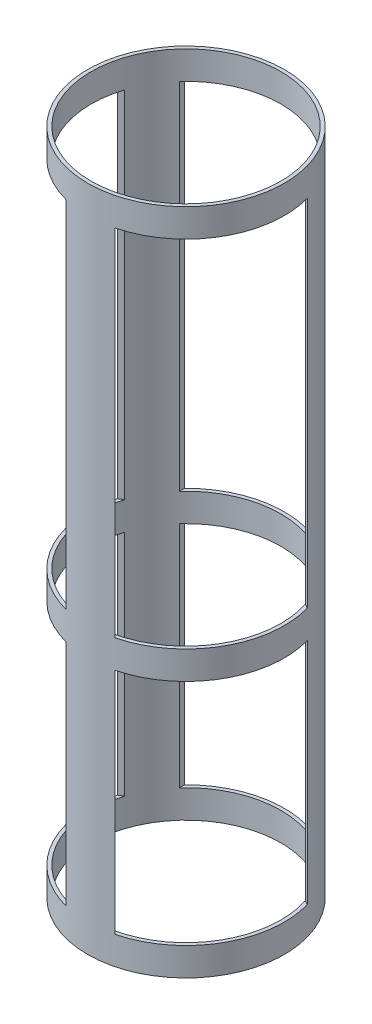
ISO-10303-21;
HEADER;
FILE_DESCRIPTION(('STEP AP214'),'2;1');
FILE_NAME('part.step','',(''),(''),'','','');
FILE_SCHEMA(('AUTOMOTIVE_DESIGN { 1 0 10303 214 1 1 1 1 }'));
ENDSEC;
DATA;
#1=APPLICATION_CONTEXT('core data for automotive mechanical design processes');
#2=APPLICATION_PROTOCOL_DEFINITION('international standard','automotive_design',2000,#1);
#3=PRODUCT_CONTEXT('',#1,'mechanical');
#4=PRODUCT('Part','Part','',(#3));
#5=PRODUCT_RELATED_PRODUCT_CATEGORY('part','',(#4));
#6=PRODUCT_DEFINITION_FORMATION('','',#4);
#7=PRODUCT_DEFINITION_CONTEXT('part definition',#1,'design');
#8=PRODUCT_DEFINITION('design','',#6,#7);
#9=PRODUCT_DEFINITION_SHAPE('','',#8);
#10=(LENGTH_UNIT() NAMED_UNIT(*) SI_UNIT(.MILLI.,.METRE.));
#11=(NAMED_UNIT(*) PLANE_ANGLE_UNIT() SI_UNIT($,.RADIAN.));
#12=(NAMED_UNIT(*) SI_UNIT($,.STERADIAN.) SOLID_ANGLE_UNIT());
#13=UNCERTAINTY_MEASURE_WITH_UNIT(LENGTH_MEASURE(1.E-05),#10,'distance_accuracy_value','');
#14=(GEOMETRIC_REPRESENTATION_CONTEXT(3) GLOBAL_UNCERTAINTY_ASSIGNED_CONTEXT((#13)) GLOBAL_UNIT_ASSIGNED_CONTEXT((#10,
#11,#12)) REPRESENTATION_CONTEXT('',''));
#15=CARTESIAN_POINT('',(0.,0.,0.));
#16=DIRECTION('',(0.,0.,1.));
#17=DIRECTION('',(1.,0.,0.));
#18=AXIS2_PLACEMENT_3D('',#15,#16,#17);
#19=CARTESIAN_POINT('',(0.,301.625,0.));
#20=DIRECTION('',(0.,1.,0.));
#21=DIRECTION('',(0.,0.,1.));
#22=AXIS2_PLACEMENT_3D('',#19,#20,#21);
#23=PLANE('',#22);
#24=CARTESIAN_POINT('',(0.,301.625,0.));
#25=DIRECTION('',(0.,1.,0.));
#26=DIRECTION('',(0.,0.,1.));
#27=AXIS2_PLACEMENT_3D('',#24,#25,#26);
#28=CIRCLE('',#27,88.9);
#29=CARTESIAN_POINT('',(0.,301.625,88.9));
#30=VERTEX_POINT('',#29);
#31=EDGE_CURVE('E380',#30,#30,#28,.T.);
#32=ORIENTED_EDGE('',*,*,#31,.T.);
#33=EDGE_LOOP('',(#32));
#34=FACE_BOUND('',#33,.T.);
#35=CARTESIAN_POINT('',(0.,301.625,0.));
#36=DIRECTION('',(0.,1.,0.));
#37=DIRECTION('',(0.,0.,1.));
#38=AXIS2_PLACEMENT_3D('',#35,#36,#37);
#39=CIRCLE('',#38,85.725);
#40=CARTESIAN_POINT('',(0.,301.625,85.725));
#41=VERTEX_POINT('',#40);
#42=EDGE_CURVE('E374',#41,#41,#39,.T.);
#43=ORIENTED_EDGE('',*,*,#42,.F.);
#44=EDGE_LOOP('',(#43));
#45=FACE_BOUND('',#44,.T.);
#46=ADVANCED_FACE('F41',(#34,#45),#23,.T.);
#47=CARTESIAN_POINT('',(0.,-301.625,0.));
#48=DIRECTION('',(0.,1.,0.));
#49=DIRECTION('',(0.,0.,1.));
#50=AXIS2_PLACEMENT_3D('',#47,#48,#49);
#51=PLANE('',#50);
#52=CARTESIAN_POINT('',(0.,-301.625,0.));
#53=DIRECTION('',(0.,1.,0.));
#54=DIRECTION('',(0.,0.,1.));
#55=AXIS2_PLACEMENT_3D('',#52,#53,#54);
#56=CIRCLE('',#55,88.9);
#57=CARTESIAN_POINT('',(0.,-301.625,88.9));
#58=VERTEX_POINT('',#57);
#59=EDGE_CURVE('E377',#58,#58,#56,.T.);
#60=ORIENTED_EDGE('',*,*,#59,.F.);
#61=EDGE_LOOP('',(#60));
#62=FACE_BOUND('',#61,.T.);
#63=CARTESIAN_POINT('',(0.,-301.625,0.));
#64=DIRECTION('',(0.,1.,0.));
#65=DIRECTION('',(0.,0.,1.));
#66=AXIS2_PLACEMENT_3D('',#63,#64,#65);
#67=CIRCLE('',#66,85.725);
#68=CARTESIAN_POINT('',(0.,-301.625,85.725));
#69=VERTEX_POINT('',#68);
#70=EDGE_CURVE('E332',#69,#69,#67,.T.);
#71=ORIENTED_EDGE('',*,*,#70,.T.);
#72=EDGE_LOOP('',(#71));
#73=FACE_BOUND('',#72,.T.);
#74=ADVANCED_FACE('F419',(#62,#73),#51,.F.);
#75=CARTESIAN_POINT('',(0.,301.625,0.));
#76=DIRECTION('',(0.,-1.,0.));
#77=DIRECTION('',(0.,0.,-1.));
#78=AXIS2_PLACEMENT_3D('',#75,#76,#77);
#79=CYLINDRICAL_SURFACE('',#78,88.9);
#80=CARTESIAN_POINT('',(0.,-44.3229999999999,0.));
#81=DIRECTION('',(0.,-1.,0.));
#82=DIRECTION('',(-0.500000000000004,0.,0.866025403784436));
#83=AXIS2_PLACEMENT_3D('',#80,#81,#82);
#84=CIRCLE('',#83,88.9);
#85=CARTESIAN_POINT('',(22.1315367264145,-44.3229999999999,86.1011328736583));
#86=VERTEX_POINT('',#85);
#87=CARTESIAN_POINT('',(85.631536726415,-44.323,-23.8840934069651));
#88=VERTEX_POINT('',#87);
#89=EDGE_CURVE('E234',#86,#88,#84,.F.);
#90=ORIENTED_EDGE('',*,*,#89,.F.);
#91=DIRECTION('',(0.,-1.,0.));
#92=VECTOR('',#91,1.);
#93=CARTESIAN_POINT('',(22.1315367264145,301.625,86.1011328736583));
#94=LINE('',#93,#92);
#95=CARTESIAN_POINT('',(22.1315367264145,276.225,86.1011328736583));
#96=VERTEX_POINT('',#95);
#97=EDGE_CURVE('E239',#96,#86,#94,.T.);
#98=ORIENTED_EDGE('',*,*,#97,.F.);
#99=CARTESIAN_POINT('',(0.,276.225,0.));
#100=DIRECTION('',(0.,1.,0.));
#101=DIRECTION('',(-0.866025403784436,0.,-0.500000000000004));
#102=AXIS2_PLACEMENT_3D('',#99,#100,#101);
#103=CIRCLE('',#102,88.9);
#104=CARTESIAN_POINT('',(85.631536726415,276.225,-23.8840934069651));
#105=VERTEX_POINT('',#104);
#106=EDGE_CURVE('E213',#105,#96,#103,.F.);
#107=ORIENTED_EDGE('',*,*,#106,.F.);
#108=DIRECTION('',(0.,-1.,0.));
#109=VECTOR('',#108,1.);
#110=CARTESIAN_POINT('',(85.631536726415,301.625,-23.8840934069651));
#111=LINE('',#110,#109);
#112=EDGE_CURVE('E56',#88,#105,#111,.F.);
#113=ORIENTED_EDGE('',*,*,#112,.F.);
#114=EDGE_LOOP('',(#90,#98,#107,#113));
#115=FACE_BOUND('',#114,.T.);
#116=CARTESIAN_POINT('',(0.,-44.3229999999999,0.));
#117=DIRECTION('',(0.,-1.,0.));
#118=DIRECTION('',(-0.499999999999992,0.,-0.866025403784443));
#119=AXIS2_PLACEMENT_3D('',#116,#117,#118);
#120=CIRCLE('',#119,88.9);
#121=CARTESIAN_POINT('',(-85.6315367264147,-44.3229999999999,-23.8840934069663));
#122=VERTEX_POINT('',#121);
#123=CARTESIAN_POINT('',(-22.1315367264157,-44.323,86.101132873658));
#124=VERTEX_POINT('',#123);
#125=EDGE_CURVE('E263',#122,#124,#120,.F.);
#126=ORIENTED_EDGE('',*,*,#125,.F.);
#127=DIRECTION('',(0.,-1.,0.));
#128=VECTOR('',#127,1.);
#129=CARTESIAN_POINT('',(-85.6315367264147,301.625,-23.8840934069663));
#130=LINE('',#129,#128);
#131=CARTESIAN_POINT('',(-85.6315367264147,276.225,-23.8840934069663));
#132=VERTEX_POINT('',#131);
#133=EDGE_CURVE('E214',#132,#122,#130,.T.);
#134=ORIENTED_EDGE('',*,*,#133,.F.);
#135=CARTESIAN_POINT('',(0.,276.225,0.));
#136=DIRECTION('',(0.,1.,0.));
#137=DIRECTION('',(0.866025403784443,0.,-0.499999999999992));
#138=AXIS2_PLACEMENT_3D('',#135,#136,#137);
#139=CIRCLE('',#138,88.9);
#140=CARTESIAN_POINT('',(-22.1315367264157,276.225,86.101132873658));
#141=VERTEX_POINT('',#140);
#142=EDGE_CURVE('E245',#141,#132,#139,.F.);
#143=ORIENTED_EDGE('',*,*,#142,.F.);
#144=DIRECTION('',(0.,-1.,0.));
#145=VECTOR('',#144,1.);
#146=CARTESIAN_POINT('',(-22.1315367264157,301.625,86.101132873658));
#147=LINE('',#146,#145);
#148=EDGE_CURVE('E64',#124,#141,#147,.F.);
#149=ORIENTED_EDGE('',*,*,#148,.F.);
#150=EDGE_LOOP('',(#126,#134,#143,#149));
#151=FACE_BOUND('',#150,.T.);
#152=CARTESIAN_POINT('',(0.,-276.225,0.));
#153=DIRECTION('',(0.,-1.,0.));
#154=DIRECTION('',(0.866025403784436,0.,0.500000000000004));
#155=AXIS2_PLACEMENT_3D('',#152,#153,#154);
#156=CIRCLE('',#155,88.9);
#157=CARTESIAN_POINT('',(22.1315367264145,-276.225,86.1011328736583));
#158=VERTEX_POINT('',#157);
#159=CARTESIAN_POINT('',(85.631536726415,-276.225,-23.8840934069651));
#160=VERTEX_POINT('',#159);
#161=EDGE_CURVE('E293',#158,#160,#156,.F.);
#162=ORIENTED_EDGE('',*,*,#161,.F.);
#163=DIRECTION('',(0.,-1.,0.));
#164=VECTOR('',#163,1.);
#165=CARTESIAN_POINT('',(22.1315367264145,301.625,86.1011328736583));
#166=LINE('',#165,#164);
#167=CARTESIAN_POINT('',(22.1315367264145,-69.7229999999999,86.1011328736583));
#168=VERTEX_POINT('',#167);
#169=EDGE_CURVE('E298',#168,#158,#166,.T.);
#170=ORIENTED_EDGE('',*,*,#169,.F.);
#171=CARTESIAN_POINT('',(0.,-69.7229999999999,0.));
#172=DIRECTION('',(0.,1.,0.));
#173=DIRECTION('',(0.500000000000004,0.,-0.866025403784436));
#174=AXIS2_PLACEMENT_3D('',#171,#172,#173);
#175=CIRCLE('',#174,88.9);
#176=CARTESIAN_POINT('',(85.631536726415,-69.7229999999999,-23.8840934069651));
#177=VERTEX_POINT('',#176);
#178=EDGE_CURVE('E272',#177,#168,#175,.F.);
#179=ORIENTED_EDGE('',*,*,#178,.F.);
#180=DIRECTION('',(0.,-1.,0.));
#181=VECTOR('',#180,1.);
#182=CARTESIAN_POINT('',(85.631536726415,301.625,-23.8840934069651));
#183=LINE('',#182,#181);
#184=EDGE_CURVE('E286',#160,#177,#183,.F.);
#185=ORIENTED_EDGE('',*,*,#184,.F.);
#186=EDGE_LOOP('',(#162,#170,#179,#185));
#187=FACE_BOUND('',#186,.T.);
#188=CARTESIAN_POINT('',(0.,-276.225,0.));
#189=DIRECTION('',(0.,-1.,0.));
#190=DIRECTION('',(-0.866025403784443,0.,0.499999999999992));
#191=AXIS2_PLACEMENT_3D('',#188,#189,#190);
#192=CIRCLE('',#191,88.9);
#193=CARTESIAN_POINT('',(-85.6315367264147,-276.225,-23.8840934069663));
#194=VERTEX_POINT('',#193);
#195=CARTESIAN_POINT('',(-22.1315367264157,-276.225,86.101132873658));
#196=VERTEX_POINT('',#195);
#197=EDGE_CURVE('E323',#194,#196,#192,.F.);
#198=ORIENTED_EDGE('',*,*,#197,.F.);
#199=DIRECTION('',(0.,-1.,0.));
#200=VECTOR('',#199,1.);
#201=CARTESIAN_POINT('',(-85.6315367264147,301.625,-23.8840934069663));
#202=LINE('',#201,#200);
#203=CARTESIAN_POINT('',(-85.6315367264147,-69.7229999999999,-23.8840934069663));
#204=VERTEX_POINT('',#203);
#205=EDGE_CURVE('E273',#204,#194,#202,.T.);
#206=ORIENTED_EDGE('',*,*,#205,.F.);
#207=CARTESIAN_POINT('',(0.,-69.7229999999999,0.));
#208=DIRECTION('',(0.,1.,0.));
#209=DIRECTION('',(0.499999999999992,0.,0.866025403784443));
#210=AXIS2_PLACEMENT_3D('',#207,#208,#209);
#211=CIRCLE('',#210,88.9);
#212=CARTESIAN_POINT('',(-22.1315367264157,-69.7229999999999,86.101132873658));
#213=VERTEX_POINT('',#212);
#214=EDGE_CURVE('E303',#213,#204,#211,.F.);
#215=ORIENTED_EDGE('',*,*,#214,.F.);
#216=DIRECTION('',(0.,-1.,0.));
#217=VECTOR('',#216,1.);
#218=CARTESIAN_POINT('',(-22.1315367264157,301.625,86.101132873658));
#219=LINE('',#218,#217);
#220=EDGE_CURVE('E316',#196,#213,#219,.F.);
#221=ORIENTED_EDGE('',*,*,#220,.F.);
#222=EDGE_LOOP('',(#198,#206,#215,#221));
#223=FACE_BOUND('',#222,.T.);
#224=CARTESIAN_POINT('',(0.,-276.225,0.));
#225=DIRECTION('',(0.,-1.,0.));
#226=DIRECTION('',(0.,0.,-1.));
#227=AXIS2_PLACEMENT_3D('',#224,#225,#226);
#228=CIRCLE('',#227,88.9);
#229=CARTESIAN_POINT('',(63.5,-276.225,-62.2170394666927));
#230=VERTEX_POINT('',#229);
#231=CARTESIAN_POINT('',(-63.5,-276.225,-62.2170394666927));
#232=VERTEX_POINT('',#231);
#233=EDGE_CURVE('E333',#230,#232,#228,.F.);
#234=ORIENTED_EDGE('',*,*,#233,.F.);
#235=DIRECTION('',(0.,-1.,0.));
#236=VECTOR('',#235,1.);
#237=CARTESIAN_POINT('',(63.5,301.625,-62.2170394666927));
#238=LINE('',#237,#236);
#239=CARTESIAN_POINT('',(63.5,-69.7229999999999,-62.2170394666927));
#240=VERTEX_POINT('',#239);
#241=EDGE_CURVE('E336',#240,#230,#238,.T.);
#242=ORIENTED_EDGE('',*,*,#241,.F.);
#243=CARTESIAN_POINT('',(0.,-69.7229999999999,0.));
#244=DIRECTION('',(0.,1.,0.));
#245=DIRECTION('',(-1.,0.,0.));
#246=AXIS2_PLACEMENT_3D('',#243,#244,#245);
#247=CIRCLE('',#246,88.9);
#248=CARTESIAN_POINT('',(-63.5,-69.7229999999999,-62.2170394666927));
#249=VERTEX_POINT('',#248);
#250=EDGE_CURVE('E339',#249,#240,#247,.F.);
#251=ORIENTED_EDGE('',*,*,#250,.F.);
#252=DIRECTION('',(0.,-1.,0.));
#253=VECTOR('',#252,1.);
#254=CARTESIAN_POINT('',(-63.5,301.625,-62.2170394666927));
#255=LINE('',#254,#253);
#256=EDGE_CURVE('E330',#232,#249,#255,.F.);
#257=ORIENTED_EDGE('',*,*,#256,.F.);
#258=EDGE_LOOP('',(#234,#242,#251,#257));
#259=FACE_BOUND('',#258,.T.);
#260=CARTESIAN_POINT('',(0.,-44.3229999999999,0.));
#261=DIRECTION('',(0.,-1.,0.));
#262=DIRECTION('',(1.,0.,0.));
#263=AXIS2_PLACEMENT_3D('',#260,#261,#262);
#264=CIRCLE('',#263,88.9);
#265=CARTESIAN_POINT('',(63.5,-44.3229999999999,-62.2170394666927));
#266=VERTEX_POINT('',#265);
#267=CARTESIAN_POINT('',(-63.5,-44.323,-62.2170394666927));
#268=VERTEX_POINT('',#267);
#269=EDGE_CURVE('E355',#266,#268,#264,.F.);
#270=ORIENTED_EDGE('',*,*,#269,.F.);
#271=DIRECTION('',(0.,-1.,0.));
#272=VECTOR('',#271,1.);
#273=CARTESIAN_POINT('',(63.5,301.625,-62.2170394666927));
#274=LINE('',#273,#272);
#275=CARTESIAN_POINT('',(63.5,276.225,-62.2170394666927));
#276=VERTEX_POINT('',#275);
#277=EDGE_CURVE('E358',#276,#266,#274,.T.);
#278=ORIENTED_EDGE('',*,*,#277,.F.);
#279=CARTESIAN_POINT('',(0.,276.225,0.));
#280=DIRECTION('',(0.,1.,0.));
#281=DIRECTION('',(0.,0.,1.));
#282=AXIS2_PLACEMENT_3D('',#279,#280,#281);
#283=CIRCLE('',#282,88.9);
#284=CARTESIAN_POINT('',(-63.5,276.225,-62.2170394666927));
#285=VERTEX_POINT('',#284);
#286=EDGE_CURVE('E361',#285,#276,#283,.F.);
#287=ORIENTED_EDGE('',*,*,#286,.F.);
#288=DIRECTION('',(0.,-1.,0.));
#289=VECTOR('',#288,1.);
#290=CARTESIAN_POINT('',(-63.5,301.625,-62.2170394666927));
#291=LINE('',#290,#289);
#292=EDGE_CURVE('E353',#268,#285,#291,.F.);
#293=ORIENTED_EDGE('',*,*,#292,.F.);
#294=EDGE_LOOP('',(#270,#278,#287,#293));
#295=FACE_BOUND('',#294,.T.);
#296=ORIENTED_EDGE('',*,*,#31,.F.);
#297=EDGE_LOOP('',(#296));
#298=FACE_BOUND('',#297,.T.);
#299=ORIENTED_EDGE('',*,*,#59,.T.);
#300=EDGE_LOOP('',(#299));
#301=FACE_BOUND('',#300,.T.);
#302=ADVANCED_FACE('F43',(#115,#151,#187,#223,#259,#295,#298,#301),#79,.T.);
#303=CARTESIAN_POINT('',(0.,301.625,0.));
#304=DIRECTION('',(0.,-1.,0.));
#305=DIRECTION('',(0.,0.,-1.));
#306=AXIS2_PLACEMENT_3D('',#303,#304,#305);
#307=CYLINDRICAL_SURFACE('',#306,85.725);
#308=DIRECTION('',(0.,-1.,0.));
#309=VECTOR('',#308,1.);
#310=CARTESIAN_POINT('',(18.1237828798855,301.625,83.787255111519));
#311=LINE('',#310,#309);
#312=CARTESIAN_POINT('',(18.1237828798855,-44.3229999999999,83.787255111519));
#313=VERTEX_POINT('',#312);
#314=CARTESIAN_POINT('',(18.1237828798855,276.225,83.787255111519));
#315=VERTEX_POINT('',#314);
#316=EDGE_CURVE('E237',#313,#315,#311,.F.);
#317=ORIENTED_EDGE('',*,*,#316,.F.);
#318=CARTESIAN_POINT('',(0.,-44.3229999999999,0.));
#319=DIRECTION('',(0.,-1.,0.));
#320=DIRECTION('',(-0.500000000000004,0.,0.866025403784436));
#321=AXIS2_PLACEMENT_3D('',#318,#319,#320);
#322=CIRCLE('',#321,85.725);
#323=CARTESIAN_POINT('',(81.623782879886,-44.323,-26.1979711691044));
#324=VERTEX_POINT('',#323);
#325=EDGE_CURVE('E223',#324,#313,#322,.T.);
#326=ORIENTED_EDGE('',*,*,#325,.F.);
#327=DIRECTION('',(0.,-1.,0.));
#328=VECTOR('',#327,1.);
#329=CARTESIAN_POINT('',(81.623782879886,301.625,-26.1979711691044));
#330=LINE('',#329,#328);
#331=CARTESIAN_POINT('',(81.623782879886,276.225,-26.1979711691044));
#332=VERTEX_POINT('',#331);
#333=EDGE_CURVE('E217',#332,#324,#330,.T.);
#334=ORIENTED_EDGE('',*,*,#333,.F.);
#335=CARTESIAN_POINT('',(0.,276.225,0.));
#336=DIRECTION('',(0.,1.,0.));
#337=DIRECTION('',(-0.866025403784436,0.,-0.500000000000004));
#338=AXIS2_PLACEMENT_3D('',#335,#336,#337);
#339=CIRCLE('',#338,85.725);
#340=EDGE_CURVE('E204',#315,#332,#339,.T.);
#341=ORIENTED_EDGE('',*,*,#340,.F.);
#342=EDGE_LOOP('',(#317,#326,#334,#341));
#343=FACE_BOUND('',#342,.T.);
#344=DIRECTION('',(0.,-1.,0.));
#345=VECTOR('',#344,1.);
#346=CARTESIAN_POINT('',(-81.6237828798856,301.625,-26.1979711691055));
#347=LINE('',#346,#345);
#348=CARTESIAN_POINT('',(-81.6237828798856,-44.3229999999999,-26.1979711691055));
#349=VERTEX_POINT('',#348);
#350=CARTESIAN_POINT('',(-81.6237828798857,276.225,-26.1979711691055));
#351=VERTEX_POINT('',#350);
#352=EDGE_CURVE('E266',#349,#351,#347,.F.);
#353=ORIENTED_EDGE('',*,*,#352,.F.);
#354=CARTESIAN_POINT('',(0.,-44.3229999999999,0.));
#355=DIRECTION('',(0.,-1.,0.));
#356=DIRECTION('',(-0.499999999999992,0.,-0.866025403784443));
#357=AXIS2_PLACEMENT_3D('',#354,#355,#356);
#358=CIRCLE('',#357,85.725);
#359=CARTESIAN_POINT('',(-18.1237828798867,-44.323,83.7872551115187));
#360=VERTEX_POINT('',#359);
#361=EDGE_CURVE('E258',#360,#349,#358,.T.);
#362=ORIENTED_EDGE('',*,*,#361,.F.);
#363=DIRECTION('',(0.,-1.,0.));
#364=VECTOR('',#363,1.);
#365=CARTESIAN_POINT('',(-18.1237828798867,301.625,83.7872551115187));
#366=LINE('',#365,#364);
#367=CARTESIAN_POINT('',(-18.1237828798867,276.225,83.7872551115187));
#368=VERTEX_POINT('',#367);
#369=EDGE_CURVE('E252',#368,#360,#366,.T.);
#370=ORIENTED_EDGE('',*,*,#369,.F.);
#371=CARTESIAN_POINT('',(0.,276.225,0.));
#372=DIRECTION('',(0.,1.,0.));
#373=DIRECTION('',(0.866025403784443,0.,-0.499999999999992));
#374=AXIS2_PLACEMENT_3D('',#371,#372,#373);
#375=CIRCLE('',#374,85.725);
#376=EDGE_CURVE('E243',#351,#368,#375,.T.);
#377=ORIENTED_EDGE('',*,*,#376,.F.);
#378=EDGE_LOOP('',(#353,#362,#370,#377));
#379=FACE_BOUND('',#378,.T.);
#380=DIRECTION('',(0.,-1.,0.));
#381=VECTOR('',#380,1.);
#382=CARTESIAN_POINT('',(18.1237828798855,301.625,83.787255111519));
#383=LINE('',#382,#381);
#384=CARTESIAN_POINT('',(18.1237828798855,-276.225,83.787255111519));
#385=VERTEX_POINT('',#384);
#386=CARTESIAN_POINT('',(18.1237828798855,-69.7229999999999,83.787255111519));
#387=VERTEX_POINT('',#386);
#388=EDGE_CURVE('E296',#385,#387,#383,.F.);
#389=ORIENTED_EDGE('',*,*,#388,.F.);
#390=CARTESIAN_POINT('',(0.,-276.225,0.));
#391=DIRECTION('',(0.,-1.,0.));
#392=DIRECTION('',(0.866025403784436,0.,0.500000000000004));
#393=AXIS2_PLACEMENT_3D('',#390,#391,#392);
#394=CIRCLE('',#393,85.725);
#395=CARTESIAN_POINT('',(81.623782879886,-276.225,-26.1979711691044));
#396=VERTEX_POINT('',#395);
#397=EDGE_CURVE('E288',#396,#385,#394,.T.);
#398=ORIENTED_EDGE('',*,*,#397,.F.);
#399=DIRECTION('',(0.,-1.,0.));
#400=VECTOR('',#399,1.);
#401=CARTESIAN_POINT('',(81.623782879886,301.625,-26.1979711691044));
#402=LINE('',#401,#400);
#403=CARTESIAN_POINT('',(81.623782879886,-69.7229999999999,-26.1979711691044));
#404=VERTEX_POINT('',#403);
#405=EDGE_CURVE('E281',#404,#396,#402,.T.);
#406=ORIENTED_EDGE('',*,*,#405,.F.);
#407=CARTESIAN_POINT('',(0.,-69.7229999999999,0.));
#408=DIRECTION('',(0.,1.,0.));
#409=DIRECTION('',(0.500000000000004,0.,-0.866025403784436));
#410=AXIS2_PLACEMENT_3D('',#407,#408,#409);
#411=CIRCLE('',#410,85.725);
#412=EDGE_CURVE('E270',#387,#404,#411,.T.);
#413=ORIENTED_EDGE('',*,*,#412,.F.);
#414=EDGE_LOOP('',(#389,#398,#406,#413));
#415=FACE_BOUND('',#414,.T.);
#416=DIRECTION('',(0.,-1.,0.));
#417=VECTOR('',#416,1.);
#418=CARTESIAN_POINT('',(-81.6237828798856,301.625,-26.1979711691055));
#419=LINE('',#418,#417);
#420=CARTESIAN_POINT('',(-81.6237828798856,-276.225,-26.1979711691055));
#421=VERTEX_POINT('',#420);
#422=CARTESIAN_POINT('',(-81.6237828798857,-69.7229999999999,-26.1979711691055));
#423=VERTEX_POINT('',#422);
#424=EDGE_CURVE('E326',#421,#423,#419,.F.);
#425=ORIENTED_EDGE('',*,*,#424,.F.);
#426=CARTESIAN_POINT('',(0.,-276.225,0.));
#427=DIRECTION('',(0.,-1.,0.));
#428=DIRECTION('',(-0.866025403784443,0.,0.499999999999992));
#429=AXIS2_PLACEMENT_3D('',#426,#427,#428);
#430=CIRCLE('',#429,85.725);
#431=CARTESIAN_POINT('',(-18.1237828798867,-276.225,83.7872551115187));
#432=VERTEX_POINT('',#431);
#433=EDGE_CURVE('E318',#432,#421,#430,.T.);
#434=ORIENTED_EDGE('',*,*,#433,.F.);
#435=DIRECTION('',(0.,-1.,0.));
#436=VECTOR('',#435,1.);
#437=CARTESIAN_POINT('',(-18.1237828798867,301.625,83.7872551115187));
#438=LINE('',#437,#436);
#439=CARTESIAN_POINT('',(-18.1237828798867,-69.7229999999999,83.7872551115187));
#440=VERTEX_POINT('',#439);
#441=EDGE_CURVE('E311',#440,#432,#438,.T.);
#442=ORIENTED_EDGE('',*,*,#441,.F.);
#443=CARTESIAN_POINT('',(0.,-69.7229999999999,0.));
#444=DIRECTION('',(0.,1.,0.));
#445=DIRECTION('',(0.499999999999992,0.,0.866025403784443));
#446=AXIS2_PLACEMENT_3D('',#443,#444,#445);
#447=CIRCLE('',#446,85.725);
#448=EDGE_CURVE('E242',#423,#440,#447,.T.);
#449=ORIENTED_EDGE('',*,*,#448,.F.);
#450=EDGE_LOOP('',(#425,#434,#442,#449));
#451=FACE_BOUND('',#450,.T.);
#452=DIRECTION('',(0.,-1.,0.));
#453=VECTOR('',#452,1.);
#454=CARTESIAN_POINT('',(63.5,301.625,-57.5892839424141));
#455=LINE('',#454,#453);
#456=CARTESIAN_POINT('',(63.5,-276.225,-57.5892839424141));
#457=VERTEX_POINT('',#456);
#458=CARTESIAN_POINT('',(63.5,-69.7229999999999,-57.5892839424141));
#459=VERTEX_POINT('',#458);
#460=EDGE_CURVE('E11',#457,#459,#455,.F.);
#461=ORIENTED_EDGE('',*,*,#460,.F.);
#462=CARTESIAN_POINT('',(0.,-276.225,0.));
#463=DIRECTION('',(0.,-1.,0.));
#464=DIRECTION('',(0.,0.,-1.));
#465=AXIS2_PLACEMENT_3D('',#462,#463,#464);
#466=CIRCLE('',#465,85.725);
#467=CARTESIAN_POINT('',(-63.5,-276.225,-57.5892839424141));
#468=VERTEX_POINT('',#467);
#469=EDGE_CURVE('E49',#468,#457,#466,.T.);
#470=ORIENTED_EDGE('',*,*,#469,.F.);
#471=DIRECTION('',(0.,-1.,0.));
#472=VECTOR('',#471,1.);
#473=CARTESIAN_POINT('',(-63.5,301.625,-57.5892839424141));
#474=LINE('',#473,#472);
#475=CARTESIAN_POINT('',(-63.5,-69.7229999999999,-57.5892839424141));
#476=VERTEX_POINT('',#475);
#477=EDGE_CURVE('E396',#476,#468,#474,.T.);
#478=ORIENTED_EDGE('',*,*,#477,.F.);
#479=CARTESIAN_POINT('',(0.,-69.7229999999999,0.));
#480=DIRECTION('',(0.,1.,0.));
#481=DIRECTION('',(-1.,0.,0.));
#482=AXIS2_PLACEMENT_3D('',#479,#480,#481);
#483=CIRCLE('',#482,85.725);
#484=EDGE_CURVE('E394',#459,#476,#483,.T.);
#485=ORIENTED_EDGE('',*,*,#484,.F.);
#486=EDGE_LOOP('',(#461,#470,#478,#485));
#487=FACE_BOUND('',#486,.T.);
#488=DIRECTION('',(0.,-1.,0.));
#489=VECTOR('',#488,1.);
#490=CARTESIAN_POINT('',(63.5,301.625,-57.5892839424141));
#491=LINE('',#490,#489);
#492=CARTESIAN_POINT('',(63.5,-44.3229999999999,-57.5892839424141));
#493=VERTEX_POINT('',#492);
#494=CARTESIAN_POINT('',(63.5,276.225,-57.5892839424141));
#495=VERTEX_POINT('',#494);
#496=EDGE_CURVE('E391',#493,#495,#491,.F.);
#497=ORIENTED_EDGE('',*,*,#496,.F.);
#498=CARTESIAN_POINT('',(0.,-44.3229999999999,0.));
#499=DIRECTION('',(0.,-1.,0.));
#500=DIRECTION('',(1.,0.,0.));
#501=AXIS2_PLACEMENT_3D('',#498,#499,#500);
#502=CIRCLE('',#501,85.725);
#503=CARTESIAN_POINT('',(-63.5,-44.323,-57.5892839424141));
#504=VERTEX_POINT('',#503);
#505=EDGE_CURVE('E389',#504,#493,#502,.T.);
#506=ORIENTED_EDGE('',*,*,#505,.F.);
#507=DIRECTION('',(0.,-1.,0.));
#508=VECTOR('',#507,1.);
#509=CARTESIAN_POINT('',(-63.5,301.625,-57.5892839424141));
#510=LINE('',#509,#508);
#511=CARTESIAN_POINT('',(-63.5,276.225,-57.5892839424141));
#512=VERTEX_POINT('',#511);
#513=EDGE_CURVE('E387',#512,#504,#510,.T.);
#514=ORIENTED_EDGE('',*,*,#513,.F.);
#515=CARTESIAN_POINT('',(0.,276.225,0.));
#516=DIRECTION('',(0.,1.,0.));
#517=DIRECTION('',(0.,0.,1.));
#518=AXIS2_PLACEMENT_3D('',#515,#516,#517);
#519=CIRCLE('',#518,85.725);
#520=EDGE_CURVE('E383',#495,#512,#519,.T.);
#521=ORIENTED_EDGE('',*,*,#520,.F.);
#522=EDGE_LOOP('',(#497,#506,#514,#521));
#523=FACE_BOUND('',#522,.T.);
#524=ORIENTED_EDGE('',*,*,#42,.T.);
#525=EDGE_LOOP('',(#524));
#526=FACE_BOUND('',#525,.T.);
#527=ORIENTED_EDGE('',*,*,#70,.F.);
#528=EDGE_LOOP('',(#527));
#529=FACE_BOUND('',#528,.T.);
#530=ADVANCED_FACE('F221',(#343,#379,#415,#451,#487,#523,#526,#529),#307,.F.);
#531=CARTESIAN_POINT('',(63.5,-44.323,-88.901));
#532=DIRECTION('',(1.,0.,0.));
#533=DIRECTION('',(0.,1.,0.));
#534=AXIS2_PLACEMENT_3D('',#531,#532,#533);
#535=PLANE('',#534);
#536=ORIENTED_EDGE('',*,*,#496,.T.);
#537=DIRECTION('',(0.,0.,1.));
#538=VECTOR('',#537,1.);
#539=CARTESIAN_POINT('',(63.5,276.225,-88.901));
#540=LINE('',#539,#538);
#541=EDGE_CURVE('E301',#276,#495,#540,.T.);
#542=ORIENTED_EDGE('',*,*,#541,.F.);
#543=ORIENTED_EDGE('',*,*,#277,.T.);
#544=DIRECTION('',(0.,0.,1.));
#545=VECTOR('',#544,1.);
#546=CARTESIAN_POINT('',(63.5,-44.323,-88.901));
#547=LINE('',#546,#545);
#548=EDGE_CURVE('E365',#266,#493,#547,.T.);
#549=ORIENTED_EDGE('',*,*,#548,.T.);
#550=EDGE_LOOP('',(#536,#542,#543,#549));
#551=FACE_BOUND('',#550,.T.);
#552=ADVANCED_FACE('F434',(#551),#535,.F.);
#553=CARTESIAN_POINT('',(63.5,-44.323,-88.901));
#554=DIRECTION('',(0.,-1.,0.));
#555=DIRECTION('',(1.,0.,0.));
#556=AXIS2_PLACEMENT_3D('',#553,#554,#555);
#557=PLANE('',#556);
#558=ORIENTED_EDGE('',*,*,#505,.T.);
#559=ORIENTED_EDGE('',*,*,#548,.F.);
#560=ORIENTED_EDGE('',*,*,#269,.T.);
#561=DIRECTION('',(0.,0.,1.));
#562=VECTOR('',#561,1.);
#563=CARTESIAN_POINT('',(-63.5,-44.323,-88.901));
#564=LINE('',#563,#562);
#565=EDGE_CURVE('E368',#268,#504,#564,.T.);
#566=ORIENTED_EDGE('',*,*,#565,.T.);
#567=EDGE_LOOP('',(#558,#559,#560,#566));
#568=FACE_BOUND('',#567,.T.);
#569=ADVANCED_FACE('F439',(#568),#557,.F.);
#570=CARTESIAN_POINT('',(-63.5,-44.323,-88.901));
#571=DIRECTION('',(-1.,0.,0.));
#572=DIRECTION('',(0.,0.,1.));
#573=AXIS2_PLACEMENT_3D('',#570,#571,#572);
#574=PLANE('',#573);
#575=ORIENTED_EDGE('',*,*,#513,.T.);
#576=ORIENTED_EDGE('',*,*,#565,.F.);
#577=ORIENTED_EDGE('',*,*,#292,.T.);
#578=DIRECTION('',(0.,0.,1.));
#579=VECTOR('',#578,1.);
#580=CARTESIAN_POINT('',(-63.5,276.225,-88.901));
#581=LINE('',#580,#579);
#582=EDGE_CURVE('E364',#285,#512,#581,.T.);
#583=ORIENTED_EDGE('',*,*,#582,.T.);
#584=EDGE_LOOP('',(#575,#576,#577,#583));
#585=FACE_BOUND('',#584,.T.);
#586=ADVANCED_FACE('F639',(#585),#574,.F.);
#587=CARTESIAN_POINT('',(63.5,276.225,-88.901));
#588=DIRECTION('',(0.,1.,0.));
#589=DIRECTION('',(0.,0.,1.));
#590=AXIS2_PLACEMENT_3D('',#587,#588,#589);
#591=PLANE('',#590);
#592=ORIENTED_EDGE('',*,*,#520,.T.);
#593=ORIENTED_EDGE('',*,*,#582,.F.);
#594=ORIENTED_EDGE('',*,*,#286,.T.);
#595=ORIENTED_EDGE('',*,*,#541,.T.);
#596=EDGE_LOOP('',(#592,#593,#594,#595));
#597=FACE_BOUND('',#596,.T.);
#598=ADVANCED_FACE('F636',(#597),#591,.F.);
#599=CARTESIAN_POINT('',(63.5,-276.225,-88.901));
#600=DIRECTION('',(1.,0.,0.));
#601=DIRECTION('',(0.,0.,-1.));
#602=AXIS2_PLACEMENT_3D('',#599,#600,#601);
#603=PLANE('',#602);
#604=ORIENTED_EDGE('',*,*,#460,.T.);
#605=DIRECTION('',(0.,0.,1.));
#606=VECTOR('',#605,1.);
#607=CARTESIAN_POINT('',(63.5,-69.723,-88.901));
#608=LINE('',#607,#606);
#609=EDGE_CURVE('E347',#240,#459,#608,.T.);
#610=ORIENTED_EDGE('',*,*,#609,.F.);
#611=ORIENTED_EDGE('',*,*,#241,.T.);
#612=DIRECTION('',(0.,0.,1.));
#613=VECTOR('',#612,1.);
#614=CARTESIAN_POINT('',(63.5,-276.225,-88.901));
#615=LINE('',#614,#613);
#616=EDGE_CURVE('E343',#230,#457,#615,.T.);
#617=ORIENTED_EDGE('',*,*,#616,.T.);
#618=EDGE_LOOP('',(#604,#610,#611,#617));
#619=FACE_BOUND('',#618,.T.);
#620=ADVANCED_FACE('F404',(#619),#603,.F.);
#621=CARTESIAN_POINT('',(63.5,-276.225,-88.901));
#622=DIRECTION('',(0.,-1.,0.));
#623=DIRECTION('',(0.,0.,-1.));
#624=AXIS2_PLACEMENT_3D('',#621,#622,#623);
#625=PLANE('',#624);
#626=ORIENTED_EDGE('',*,*,#469,.T.);
#627=ORIENTED_EDGE('',*,*,#616,.F.);
#628=ORIENTED_EDGE('',*,*,#233,.T.);
#629=DIRECTION('',(0.,0.,1.));
#630=VECTOR('',#629,1.);
#631=CARTESIAN_POINT('',(-63.5,-276.225,-88.901));
#632=LINE('',#631,#630);
#633=EDGE_CURVE('E346',#232,#468,#632,.T.);
#634=ORIENTED_EDGE('',*,*,#633,.T.);
#635=EDGE_LOOP('',(#626,#627,#628,#634));
#636=FACE_BOUND('',#635,.T.);
#637=ADVANCED_FACE('F399',(#636),#625,.F.);
#638=CARTESIAN_POINT('',(-63.5,-276.225,-88.901));
#639=DIRECTION('',(-1.,0.,0.));
#640=DIRECTION('',(0.,0.,1.));
#641=AXIS2_PLACEMENT_3D('',#638,#639,#640);
#642=PLANE('',#641);
#643=ORIENTED_EDGE('',*,*,#477,.T.);
#644=ORIENTED_EDGE('',*,*,#633,.F.);
#645=ORIENTED_EDGE('',*,*,#256,.T.);
#646=DIRECTION('',(0.,0.,1.));
#647=VECTOR('',#646,1.);
#648=CARTESIAN_POINT('',(-63.5,-69.723,-88.901));
#649=LINE('',#648,#647);
#650=EDGE_CURVE('E342',#249,#476,#649,.T.);
#651=ORIENTED_EDGE('',*,*,#650,.T.);
#652=EDGE_LOOP('',(#643,#644,#645,#651));
#653=FACE_BOUND('',#652,.T.);
#654=ADVANCED_FACE('F414',(#653),#642,.F.);
#655=CARTESIAN_POINT('',(63.5,-69.723,-88.901));
#656=DIRECTION('',(0.,1.,0.));
#657=DIRECTION('',(-1.,0.,0.));
#658=AXIS2_PLACEMENT_3D('',#655,#656,#657);
#659=PLANE('',#658);
#660=ORIENTED_EDGE('',*,*,#484,.T.);
#661=ORIENTED_EDGE('',*,*,#650,.F.);
#662=ORIENTED_EDGE('',*,*,#250,.T.);
#663=ORIENTED_EDGE('',*,*,#609,.T.);
#664=EDGE_LOOP('',(#660,#661,#662,#663));
#665=FACE_BOUND('',#664,.T.);
#666=ADVANCED_FACE('F411',(#665),#659,.F.);
#667=CARTESIAN_POINT('',(-108.74052442184,-276.225,-10.5421131403129));
#668=DIRECTION('',(-0.499999999999992,0.,-0.866025403784443));
#669=DIRECTION('',(-0.866025403784443,0.,0.499999999999992));
#670=AXIS2_PLACEMENT_3D('',#667,#668,#669);
#671=PLANE('',#670);
#672=ORIENTED_EDGE('',*,*,#424,.T.);
#673=DIRECTION('',(0.866025403784443,0.,-0.499999999999992));
#674=VECTOR('',#673,1.);
#675=CARTESIAN_POINT('',(-108.74052442184,-69.723,-10.5421131403129));
#676=LINE('',#675,#674);
#677=EDGE_CURVE('E308',#204,#423,#676,.T.);
#678=ORIENTED_EDGE('',*,*,#677,.F.);
#679=ORIENTED_EDGE('',*,*,#205,.T.);
#680=DIRECTION('',(0.866025403784443,0.,-0.499999999999992));
#681=VECTOR('',#680,1.);
#682=CARTESIAN_POINT('',(-108.74052442184,-276.225,-10.5421131403129));
#683=LINE('',#682,#681);
#684=EDGE_CURVE('E320',#194,#421,#683,.T.);
#685=ORIENTED_EDGE('',*,*,#684,.T.);
#686=EDGE_LOOP('',(#672,#678,#679,#685));
#687=FACE_BOUND('',#686,.T.);
#688=ADVANCED_FACE('F474',(#687),#671,.F.);
#689=CARTESIAN_POINT('',(-108.74052442184,-276.225,-10.5421131403129));
#690=DIRECTION('',(0.,-1.,0.));
#691=DIRECTION('',(-0.866025403784443,0.,0.499999999999992));
#692=AXIS2_PLACEMENT_3D('',#689,#690,#691);
#693=PLANE('',#692);
#694=ORIENTED_EDGE('',*,*,#433,.T.);
#695=ORIENTED_EDGE('',*,*,#684,.F.);
#696=ORIENTED_EDGE('',*,*,#197,.T.);
#697=DIRECTION('',(0.866025403784443,0.,-0.499999999999992));
#698=VECTOR('',#697,1.);
#699=CARTESIAN_POINT('',(-45.2405244218413,-276.225,99.4431131403114));
#700=LINE('',#699,#698);
#701=EDGE_CURVE('E313',#196,#432,#700,.T.);
#702=ORIENTED_EDGE('',*,*,#701,.T.);
#703=EDGE_LOOP('',(#694,#695,#696,#702));
#704=FACE_BOUND('',#703,.T.);
#705=ADVANCED_FACE('F479',(#704),#693,.F.);
#706=CARTESIAN_POINT('',(-45.2405244218413,-276.225,99.4431131403114));
#707=DIRECTION('',(0.499999999999992,0.,0.866025403784443));
#708=DIRECTION('',(0.866025403784443,0.,-0.499999999999992));
#709=AXIS2_PLACEMENT_3D('',#706,#707,#708);
#710=PLANE('',#709);
#711=ORIENTED_EDGE('',*,*,#441,.T.);
#712=ORIENTED_EDGE('',*,*,#701,.F.);
#713=ORIENTED_EDGE('',*,*,#220,.T.);
#714=DIRECTION('',(0.866025403784443,0.,-0.499999999999992));
#715=VECTOR('',#714,1.);
#716=CARTESIAN_POINT('',(-45.2405244218413,-69.723,99.4431131403114));
#717=LINE('',#716,#715);
#718=EDGE_CURVE('E305',#213,#440,#717,.T.);
#719=ORIENTED_EDGE('',*,*,#718,.T.);
#720=EDGE_LOOP('',(#711,#712,#713,#719));
#721=FACE_BOUND('',#720,.T.);
#722=ADVANCED_FACE('F489',(#721),#710,.F.);
#723=CARTESIAN_POINT('',(-108.74052442184,-69.723,-10.5421131403129));
#724=DIRECTION('',(0.,1.,0.));
#725=DIRECTION('',(0.499999999999992,0.,0.866025403784443));
#726=AXIS2_PLACEMENT_3D('',#723,#724,#725);
#727=PLANE('',#726);
#728=ORIENTED_EDGE('',*,*,#448,.T.);
#729=ORIENTED_EDGE('',*,*,#718,.F.);
#730=ORIENTED_EDGE('',*,*,#214,.T.);
#731=ORIENTED_EDGE('',*,*,#677,.T.);
#732=EDGE_LOOP('',(#728,#729,#730,#731));
#733=FACE_BOUND('',#732,.T.);
#734=ADVANCED_FACE('F499',(#733),#727,.F.);
#735=CARTESIAN_POINT('',(45.2405244218399,-276.225,99.4431131403121));
#736=DIRECTION('',(-0.500000000000004,0.,0.866025403784436));
#737=DIRECTION('',(0.866025403784436,0.,0.500000000000004));
#738=AXIS2_PLACEMENT_3D('',#735,#736,#737);
#739=PLANE('',#738);
#740=ORIENTED_EDGE('',*,*,#388,.T.);
#741=DIRECTION('',(-0.866025403784436,0.,-0.500000000000004));
#742=VECTOR('',#741,1.);
#743=CARTESIAN_POINT('',(45.2405244218399,-69.723,99.4431131403121));
#744=LINE('',#743,#742);
#745=EDGE_CURVE('E278',#168,#387,#744,.T.);
#746=ORIENTED_EDGE('',*,*,#745,.F.);
#747=ORIENTED_EDGE('',*,*,#169,.T.);
#748=DIRECTION('',(-0.866025403784436,0.,-0.500000000000004));
#749=VECTOR('',#748,1.);
#750=CARTESIAN_POINT('',(45.2405244218399,-276.225,99.4431131403121));
#751=LINE('',#750,#749);
#752=EDGE_CURVE('E290',#158,#385,#751,.T.);
#753=ORIENTED_EDGE('',*,*,#752,.T.);
#754=EDGE_LOOP('',(#740,#746,#747,#753));
#755=FACE_BOUND('',#754,.T.);
#756=ADVANCED_FACE('F509',(#755),#739,.F.);
#757=CARTESIAN_POINT('',(45.2405244218399,-276.225,99.4431131403121));
#758=DIRECTION('',(0.,-1.,0.));
#759=DIRECTION('',(0.866025403784436,0.,0.500000000000004));
#760=AXIS2_PLACEMENT_3D('',#757,#758,#759);
#761=PLANE('',#760);
#762=ORIENTED_EDGE('',*,*,#397,.T.);
#763=ORIENTED_EDGE('',*,*,#752,.F.);
#764=ORIENTED_EDGE('',*,*,#161,.T.);
#765=DIRECTION('',(-0.866025403784436,0.,-0.500000000000004));
#766=VECTOR('',#765,1.);
#767=CARTESIAN_POINT('',(108.74052442184,-276.225,-10.5421131403114));
#768=LINE('',#767,#766);
#769=EDGE_CURVE('E283',#160,#396,#768,.T.);
#770=ORIENTED_EDGE('',*,*,#769,.T.);
#771=EDGE_LOOP('',(#762,#763,#764,#770));
#772=FACE_BOUND('',#771,.T.);
#773=ADVANCED_FACE('F519',(#772),#761,.F.);
#774=CARTESIAN_POINT('',(108.74052442184,-276.225,-10.5421131403114));
#775=DIRECTION('',(0.500000000000004,0.,-0.866025403784436));
#776=DIRECTION('',(-0.866025403784436,0.,-0.500000000000004));
#777=AXIS2_PLACEMENT_3D('',#774,#775,#776);
#778=PLANE('',#777);
#779=ORIENTED_EDGE('',*,*,#405,.T.);
#780=ORIENTED_EDGE('',*,*,#769,.F.);
#781=ORIENTED_EDGE('',*,*,#184,.T.);
#782=DIRECTION('',(-0.866025403784436,0.,-0.500000000000004));
#783=VECTOR('',#782,1.);
#784=CARTESIAN_POINT('',(108.74052442184,-69.723,-10.5421131403114));
#785=LINE('',#784,#783);
#786=EDGE_CURVE('E275',#177,#404,#785,.T.);
#787=ORIENTED_EDGE('',*,*,#786,.T.);
#788=EDGE_LOOP('',(#779,#780,#781,#787));
#789=FACE_BOUND('',#788,.T.);
#790=ADVANCED_FACE('F529',(#789),#778,.F.);
#791=CARTESIAN_POINT('',(45.2405244218399,-69.723,99.4431131403121));
#792=DIRECTION('',(0.,1.,0.));
#793=DIRECTION('',(0.500000000000004,0.,-0.866025403784436));
#794=AXIS2_PLACEMENT_3D('',#791,#792,#793);
#795=PLANE('',#794);
#796=ORIENTED_EDGE('',*,*,#412,.T.);
#797=ORIENTED_EDGE('',*,*,#786,.F.);
#798=ORIENTED_EDGE('',*,*,#178,.T.);
#799=ORIENTED_EDGE('',*,*,#745,.T.);
#800=EDGE_LOOP('',(#796,#797,#798,#799));
#801=FACE_BOUND('',#800,.T.);
#802=ADVANCED_FACE('F539',(#801),#795,.F.);
#803=CARTESIAN_POINT('',(-108.74052442184,-44.323,-10.5421131403129));
#804=DIRECTION('',(-0.499999999999992,0.,-0.866025403784443));
#805=DIRECTION('',(0.,1.,0.));
#806=AXIS2_PLACEMENT_3D('',#803,#804,#805);
#807=PLANE('',#806);
#808=ORIENTED_EDGE('',*,*,#352,.T.);
#809=DIRECTION('',(0.866025403784443,0.,-0.499999999999992));
#810=VECTOR('',#809,1.);
#811=CARTESIAN_POINT('',(-108.74052442184,276.225,-10.5421131403128));
#812=LINE('',#811,#810);
#813=EDGE_CURVE('E249',#132,#351,#812,.T.);
#814=ORIENTED_EDGE('',*,*,#813,.F.);
#815=ORIENTED_EDGE('',*,*,#133,.T.);
#816=DIRECTION('',(0.866025403784443,0.,-0.499999999999992));
#817=VECTOR('',#816,1.);
#818=CARTESIAN_POINT('',(-108.74052442184,-44.323,-10.5421131403129));
#819=LINE('',#818,#817);
#820=EDGE_CURVE('E260',#122,#349,#819,.T.);
#821=ORIENTED_EDGE('',*,*,#820,.T.);
#822=EDGE_LOOP('',(#808,#814,#815,#821));
#823=FACE_BOUND('',#822,.T.);
#824=ADVANCED_FACE('F549',(#823),#807,.F.);
#825=CARTESIAN_POINT('',(-108.74052442184,-44.323,-10.5421131403129));
#826=DIRECTION('',(0.,-1.,0.));
#827=DIRECTION('',(-0.499999999999992,0.,-0.866025403784443));
#828=AXIS2_PLACEMENT_3D('',#825,#826,#827);
#829=PLANE('',#828);
#830=ORIENTED_EDGE('',*,*,#361,.T.);
#831=ORIENTED_EDGE('',*,*,#820,.F.);
#832=ORIENTED_EDGE('',*,*,#125,.T.);
#833=DIRECTION('',(0.866025403784443,0.,-0.499999999999992));
#834=VECTOR('',#833,1.);
#835=CARTESIAN_POINT('',(-45.2405244218413,-44.323,99.4431131403114));
#836=LINE('',#835,#834);
#837=EDGE_CURVE('E254',#124,#360,#836,.T.);
#838=ORIENTED_EDGE('',*,*,#837,.T.);
#839=EDGE_LOOP('',(#830,#831,#832,#838));
#840=FACE_BOUND('',#839,.T.);
#841=ADVANCED_FACE('F559',(#840),#829,.F.);
#842=CARTESIAN_POINT('',(-45.2405244218413,-44.323,99.4431131403114));
#843=DIRECTION('',(0.499999999999992,0.,0.866025403784443));
#844=DIRECTION('',(0.866025403784443,0.,-0.499999999999992));
#845=AXIS2_PLACEMENT_3D('',#842,#843,#844);
#846=PLANE('',#845);
#847=ORIENTED_EDGE('',*,*,#369,.T.);
#848=ORIENTED_EDGE('',*,*,#837,.F.);
#849=ORIENTED_EDGE('',*,*,#148,.T.);
#850=DIRECTION('',(0.866025403784443,0.,-0.499999999999992));
#851=VECTOR('',#850,1.);
#852=CARTESIAN_POINT('',(-45.2405244218413,276.225,99.4431131403114));
#853=LINE('',#852,#851);
#854=EDGE_CURVE('E247',#141,#368,#853,.T.);
#855=ORIENTED_EDGE('',*,*,#854,.T.);
#856=EDGE_LOOP('',(#847,#848,#849,#855));
#857=FACE_BOUND('',#856,.T.);
#858=ADVANCED_FACE('F569',(#857),#846,.F.);
#859=CARTESIAN_POINT('',(-108.74052442184,276.225,-10.5421131403128));
#860=DIRECTION('',(0.,1.,0.));
#861=DIRECTION('',(0.866025403784443,0.,-0.499999999999992));
#862=AXIS2_PLACEMENT_3D('',#859,#860,#861);
#863=PLANE('',#862);
#864=ORIENTED_EDGE('',*,*,#376,.T.);
#865=ORIENTED_EDGE('',*,*,#854,.F.);
#866=ORIENTED_EDGE('',*,*,#142,.T.);
#867=ORIENTED_EDGE('',*,*,#813,.T.);
#868=EDGE_LOOP('',(#864,#865,#866,#867));
#869=FACE_BOUND('',#868,.T.);
#870=ADVANCED_FACE('F579',(#869),#863,.F.);
#871=CARTESIAN_POINT('',(45.2405244218399,-44.323,99.4431131403121));
#872=DIRECTION('',(-0.500000000000004,0.,0.866025403784436));
#873=DIRECTION('',(0.,1.,0.));
#874=AXIS2_PLACEMENT_3D('',#871,#872,#873);
#875=PLANE('',#874);
#876=ORIENTED_EDGE('',*,*,#316,.T.);
#877=DIRECTION('',(-0.866025403784436,0.,-0.500000000000004));
#878=VECTOR('',#877,1.);
#879=CARTESIAN_POINT('',(45.2405244218399,276.225,99.4431131403121));
#880=LINE('',#879,#878);
#881=EDGE_CURVE('E209',#96,#315,#880,.T.);
#882=ORIENTED_EDGE('',*,*,#881,.F.);
#883=ORIENTED_EDGE('',*,*,#97,.T.);
#884=DIRECTION('',(-0.866025403784436,0.,-0.500000000000004));
#885=VECTOR('',#884,1.);
#886=CARTESIAN_POINT('',(45.2405244218399,-44.323,99.4431131403121));
#887=LINE('',#886,#885);
#888=EDGE_CURVE('E231',#86,#313,#887,.T.);
#889=ORIENTED_EDGE('',*,*,#888,.T.);
#890=EDGE_LOOP('',(#876,#882,#883,#889));
#891=FACE_BOUND('',#890,.T.);
#892=ADVANCED_FACE('F588',(#891),#875,.F.);
#893=CARTESIAN_POINT('',(45.2405244218399,-44.323,99.4431131403121));
#894=DIRECTION('',(0.,-1.,0.));
#895=DIRECTION('',(-0.500000000000004,0.,0.866025403784436));
#896=AXIS2_PLACEMENT_3D('',#893,#894,#895);
#897=PLANE('',#896);
#898=ORIENTED_EDGE('',*,*,#325,.T.);
#899=ORIENTED_EDGE('',*,*,#888,.F.);
#900=ORIENTED_EDGE('',*,*,#89,.T.);
#901=DIRECTION('',(-0.866025403784436,0.,-0.500000000000004));
#902=VECTOR('',#901,1.);
#903=CARTESIAN_POINT('',(108.74052442184,-44.323,-10.5421131403114));
#904=LINE('',#903,#902);
#905=EDGE_CURVE('E224',#88,#324,#904,.T.);
#906=ORIENTED_EDGE('',*,*,#905,.T.);
#907=EDGE_LOOP('',(#898,#899,#900,#906));
#908=FACE_BOUND('',#907,.T.);
#909=ADVANCED_FACE('F598',(#908),#897,.F.);
#910=CARTESIAN_POINT('',(108.74052442184,-44.323,-10.5421131403114));
#911=DIRECTION('',(0.500000000000004,0.,-0.866025403784436));
#912=DIRECTION('',(-0.866025403784436,0.,-0.500000000000004));
#913=AXIS2_PLACEMENT_3D('',#910,#911,#912);
#914=PLANE('',#913);
#915=ORIENTED_EDGE('',*,*,#333,.T.);
#916=ORIENTED_EDGE('',*,*,#905,.F.);
#917=ORIENTED_EDGE('',*,*,#112,.T.);
#918=DIRECTION('',(-0.866025403784436,0.,-0.500000000000004));
#919=VECTOR('',#918,1.);
#920=CARTESIAN_POINT('',(108.74052442184,276.225,-10.5421131403114));
#921=LINE('',#920,#919);
#922=EDGE_CURVE('E206',#105,#332,#921,.T.);
#923=ORIENTED_EDGE('',*,*,#922,.T.);
#924=EDGE_LOOP('',(#915,#916,#917,#923));
#925=FACE_BOUND('',#924,.T.);
#926=ADVANCED_FACE('F216',(#925),#914,.F.);
#927=CARTESIAN_POINT('',(45.2405244218399,276.225,99.4431131403121));
#928=DIRECTION('',(0.,1.,0.));
#929=DIRECTION('',(-0.866025403784436,0.,-0.500000000000004));
#930=AXIS2_PLACEMENT_3D('',#927,#928,#929);
#931=PLANE('',#930);
#932=ORIENTED_EDGE('',*,*,#340,.T.);
#933=ORIENTED_EDGE('',*,*,#922,.F.);
#934=ORIENTED_EDGE('',*,*,#106,.T.);
#935=ORIENTED_EDGE('',*,*,#881,.T.);
#936=EDGE_LOOP('',(#932,#933,#934,#935));
#937=FACE_BOUND('',#936,.T.);
#938=ADVANCED_FACE('F205',(#937),#931,.F.);
#939=CLOSED_SHELL('',(#46,#74,#302,#530,#552,#569,#586,#598,#620,#637,#654,#666,#688,#705,#722,
#734,#756,#773,#790,#802,#824,#841,#858,#870,#892,#909,#926,#938));
#940=MANIFOLD_SOLID_BREP('B2',#939);
#941=ADVANCED_BREP_SHAPE_REPRESENTATION('',(#18,#940),#14);
#942=SHAPE_DEFINITION_REPRESENTATION(#9,#941);
ENDSEC;
END-ISO-10303-21;
